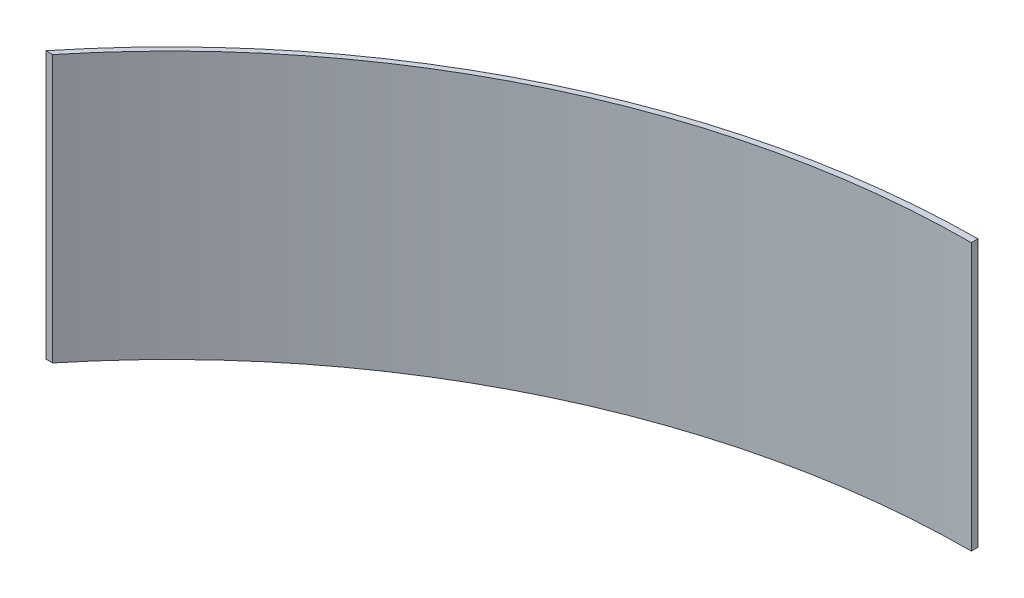
ISO-10303-21;
HEADER;
FILE_DESCRIPTION(('STEP AP214'),'2;1');
FILE_NAME('part.step','',(''),(''),'','','');
FILE_SCHEMA(('AUTOMOTIVE_DESIGN { 1 0 10303 214 1 1 1 1 }'));
ENDSEC;
DATA;
#1=APPLICATION_CONTEXT('core data for automotive mechanical design processes');
#2=APPLICATION_PROTOCOL_DEFINITION('international standard','automotive_design',2000,#1);
#3=PRODUCT_CONTEXT('',#1,'mechanical');
#4=PRODUCT('Part','Part','',(#3));
#5=PRODUCT_RELATED_PRODUCT_CATEGORY('part','',(#4));
#6=PRODUCT_DEFINITION_FORMATION('','',#4);
#7=PRODUCT_DEFINITION_CONTEXT('part definition',#1,'design');
#8=PRODUCT_DEFINITION('design','',#6,#7);
#9=PRODUCT_DEFINITION_SHAPE('','',#8);
#10=(LENGTH_UNIT() NAMED_UNIT(*) SI_UNIT(.MILLI.,.METRE.));
#11=(NAMED_UNIT(*) PLANE_ANGLE_UNIT() SI_UNIT($,.RADIAN.));
#12=(NAMED_UNIT(*) SI_UNIT($,.STERADIAN.) SOLID_ANGLE_UNIT());
#13=UNCERTAINTY_MEASURE_WITH_UNIT(LENGTH_MEASURE(1.E-05),#10,'distance_accuracy_value','');
#14=(GEOMETRIC_REPRESENTATION_CONTEXT(3) GLOBAL_UNCERTAINTY_ASSIGNED_CONTEXT((#13)) GLOBAL_UNIT_ASSIGNED_CONTEXT((#10,
#11,#12)) REPRESENTATION_CONTEXT('',''));
#15=CARTESIAN_POINT('',(0.,0.,0.));
#16=DIRECTION('',(0.,0.,1.));
#17=DIRECTION('',(1.,0.,0.));
#18=AXIS2_PLACEMENT_3D('',#15,#16,#17);
#19=CARTESIAN_POINT('',(0.,25.4,304.8));
#20=DIRECTION('',(0.,-1.,0.));
#21=DIRECTION('',(0.,0.,-1.));
#22=AXIS2_PLACEMENT_3D('',#19,#20,#21);
#23=PLANE('',#22);
#24=DIRECTION('',(0.,0.,1.));
#25=VECTOR('',#24,1.);
#26=CARTESIAN_POINT('',(59.8563579464167,25.4,304.8));
#27=LINE('',#26,#25);
#28=CARTESIAN_POINT('',(59.8563579464167,25.4,-30.8032021523766));
#29=VERTEX_POINT('',#28);
#30=CARTESIAN_POINT('',(59.8563579464167,25.4,-27.6282021523766));
#31=VERTEX_POINT('',#30);
#32=EDGE_CURVE('E101',#29,#31,#27,.T.);
#33=ORIENTED_EDGE('',*,*,#32,.T.);
#34=CARTESIAN_POINT('',(59.8563579464167,25.4,353.371797847623));
#35=DIRECTION('',(0.,-1.,0.));
#36=DIRECTION('',(0.,0.,-1.));
#37=AXIS2_PLACEMENT_3D('',#34,#35,#36);
#38=CIRCLE('',#37,381.);
#39=CARTESIAN_POINT('',(-235.991769948824,25.4,113.299131305009));
#40=VERTEX_POINT('',#39);
#41=EDGE_CURVE('E11',#31,#40,#38,.F.);
#42=ORIENTED_EDGE('',*,*,#41,.T.);
#43=DIRECTION('',(-1.,0.,0.));
#44=VECTOR('',#43,1.);
#45=CARTESIAN_POINT('',(-8.37042022287001E-13,25.4,113.299131305008));
#46=LINE('',#45,#44);
#47=CARTESIAN_POINT('',(-239.166769948824,25.4,113.299131305009));
#48=VERTEX_POINT('',#47);
#49=EDGE_CURVE('E44',#40,#48,#46,.T.);
#50=ORIENTED_EDGE('',*,*,#49,.T.);
#51=CARTESIAN_POINT('',(61.9223263555474,25.4,355.782689701787));
#52=DIRECTION('',(0.,-1.,0.));
#53=DIRECTION('',(0.,0.,-1.));
#54=AXIS2_PLACEMENT_3D('',#51,#52,#53);
#55=CIRCLE('',#54,386.591412225035);
#56=EDGE_CURVE('E80',#48,#29,#55,.T.);
#57=ORIENTED_EDGE('',*,*,#56,.T.);
#58=EDGE_LOOP('',(#33,#42,#50,#57));
#59=FACE_BOUND('',#58,.T.);
#60=ADVANCED_FACE('F36',(#59),#23,.T.);
#61=CARTESIAN_POINT('',(59.8563579464167,-101.6,353.371797847623));
#62=DIRECTION('',(0.,1.,0.));
#63=DIRECTION('',(0.,0.,1.));
#64=AXIS2_PLACEMENT_3D('',#61,#62,#63);
#65=CYLINDRICAL_SURFACE('',#64,381.);
#66=DIRECTION('',(0.,1.,0.));
#67=VECTOR('',#66,1.);
#68=CARTESIAN_POINT('',(59.8563579464167,-101.6,-27.6282021523766));
#69=LINE('',#68,#67);
#70=CARTESIAN_POINT('',(59.8563579464167,152.4,-27.6282021523766));
#71=VERTEX_POINT('',#70);
#72=EDGE_CURVE('E59',#31,#71,#69,.T.);
#73=ORIENTED_EDGE('',*,*,#72,.T.);
#74=CARTESIAN_POINT('',(59.8563579464167,152.4,353.371797847623));
#75=DIRECTION('',(0.,-1.,0.));
#76=DIRECTION('',(0.,0.,1.));
#77=AXIS2_PLACEMENT_3D('',#74,#75,#76);
#78=CIRCLE('',#77,381.);
#79=CARTESIAN_POINT('',(-235.991769948824,152.4,113.299131305009));
#80=VERTEX_POINT('',#79);
#81=EDGE_CURVE('E97',#80,#71,#78,.T.);
#82=ORIENTED_EDGE('',*,*,#81,.F.);
#83=DIRECTION('',(0.,1.,0.));
#84=VECTOR('',#83,1.);
#85=CARTESIAN_POINT('',(-235.991769948824,-101.6,113.299131305009));
#86=LINE('',#85,#84);
#87=EDGE_CURVE('E83',#40,#80,#86,.T.);
#88=ORIENTED_EDGE('',*,*,#87,.F.);
#89=ORIENTED_EDGE('',*,*,#41,.F.);
#90=EDGE_LOOP('',(#73,#82,#88,#89));
#91=FACE_BOUND('',#90,.T.);
#92=ADVANCED_FACE('F109',(#91),#65,.F.);
#93=CARTESIAN_POINT('',(-235.991769948824,-101.6,113.299131305009));
#94=DIRECTION('',(0.,0.,1.));
#95=DIRECTION('',(1.,0.,0.));
#96=AXIS2_PLACEMENT_3D('',#93,#94,#95);
#97=PLANE('',#96);
#98=ORIENTED_EDGE('',*,*,#87,.T.);
#99=DIRECTION('',(1.,0.,0.));
#100=VECTOR('',#99,1.);
#101=CARTESIAN_POINT('',(-235.991769948824,152.4,113.299131305009));
#102=LINE('',#101,#100);
#103=CARTESIAN_POINT('',(-239.166769948824,152.4,113.299131305009));
#104=VERTEX_POINT('',#103);
#105=EDGE_CURVE('E87',#104,#80,#102,.T.);
#106=ORIENTED_EDGE('',*,*,#105,.F.);
#107=DIRECTION('',(0.,1.,0.));
#108=VECTOR('',#107,1.);
#109=CARTESIAN_POINT('',(-239.166769948824,-101.6,113.299131305009));
#110=LINE('',#109,#108);
#111=EDGE_CURVE('E76',#48,#104,#110,.T.);
#112=ORIENTED_EDGE('',*,*,#111,.F.);
#113=ORIENTED_EDGE('',*,*,#49,.F.);
#114=EDGE_LOOP('',(#98,#106,#112,#113));
#115=FACE_BOUND('',#114,.T.);
#116=ADVANCED_FACE('F88',(#115),#97,.T.);
#117=CARTESIAN_POINT('',(61.9223263555474,-101.6,355.782689701787));
#118=DIRECTION('',(0.,1.,0.));
#119=DIRECTION('',(0.,0.,1.));
#120=AXIS2_PLACEMENT_3D('',#117,#118,#119);
#121=CYLINDRICAL_SURFACE('',#120,386.591412225035);
#122=ORIENTED_EDGE('',*,*,#111,.T.);
#123=CARTESIAN_POINT('',(61.9223263555474,152.4,355.782689701787));
#124=DIRECTION('',(0.,1.,0.));
#125=DIRECTION('',(0.,0.,-1.));
#126=AXIS2_PLACEMENT_3D('',#123,#124,#125);
#127=CIRCLE('',#126,386.591412225035);
#128=CARTESIAN_POINT('',(59.8563579464166,152.4,-30.8032021523766));
#129=VERTEX_POINT('',#128);
#130=EDGE_CURVE('E51',#129,#104,#127,.T.);
#131=ORIENTED_EDGE('',*,*,#130,.F.);
#132=DIRECTION('',(0.,1.,0.));
#133=VECTOR('',#132,1.);
#134=CARTESIAN_POINT('',(59.8563579464167,-101.6,-30.8032021523766));
#135=LINE('',#134,#133);
#136=EDGE_CURVE('E84',#29,#129,#135,.T.);
#137=ORIENTED_EDGE('',*,*,#136,.F.);
#138=ORIENTED_EDGE('',*,*,#56,.F.);
#139=EDGE_LOOP('',(#122,#131,#137,#138));
#140=FACE_BOUND('',#139,.T.);
#141=ADVANCED_FACE('F78',(#140),#121,.T.);
#142=CARTESIAN_POINT('',(59.8563579464167,-101.6,-27.6282021523766));
#143=DIRECTION('',(1.,0.,0.));
#144=DIRECTION('',(0.,0.,-1.));
#145=AXIS2_PLACEMENT_3D('',#142,#143,#144);
#146=PLANE('',#145);
#147=ORIENTED_EDGE('',*,*,#136,.T.);
#148=DIRECTION('',(0.,0.,-1.));
#149=VECTOR('',#148,1.);
#150=CARTESIAN_POINT('',(59.8563579464167,152.4,-27.6282021523766));
#151=LINE('',#150,#149);
#152=EDGE_CURVE('E95',#71,#129,#151,.T.);
#153=ORIENTED_EDGE('',*,*,#152,.F.);
#154=ORIENTED_EDGE('',*,*,#72,.F.);
#155=ORIENTED_EDGE('',*,*,#32,.F.);
#156=EDGE_LOOP('',(#147,#153,#154,#155));
#157=FACE_BOUND('',#156,.T.);
#158=ADVANCED_FACE('F110',(#157),#146,.T.);
#159=CARTESIAN_POINT('',(-304.8,152.4,304.8));
#160=DIRECTION('',(0.,-1.,0.));
#161=DIRECTION('',(0.,0.,-1.));
#162=AXIS2_PLACEMENT_3D('',#159,#160,#161);
#163=PLANE('',#162);
#164=ORIENTED_EDGE('',*,*,#81,.T.);
#165=ORIENTED_EDGE('',*,*,#152,.T.);
#166=ORIENTED_EDGE('',*,*,#130,.T.);
#167=ORIENTED_EDGE('',*,*,#105,.T.);
#168=EDGE_LOOP('',(#164,#165,#166,#167));
#169=FACE_BOUND('',#168,.T.);
#170=ADVANCED_FACE('F38',(#169),#163,.F.);
#171=CLOSED_SHELL('',(#60,#92,#116,#141,#158,#170));
#172=MANIFOLD_SOLID_BREP('B2',#171);
#173=ADVANCED_BREP_SHAPE_REPRESENTATION('',(#18,#172),#14);
#174=SHAPE_DEFINITION_REPRESENTATION(#9,#173);
ENDSEC;
END-ISO-10303-21;
